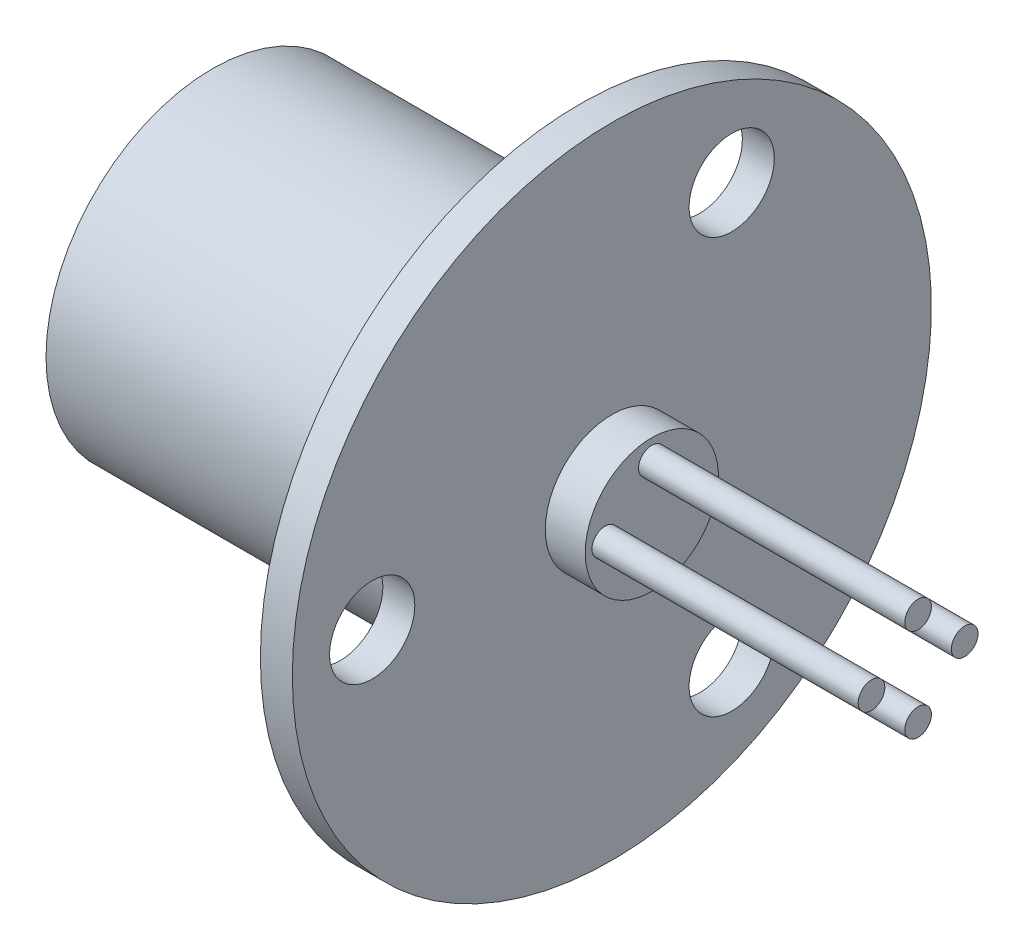
ISO-10303-21;
HEADER;
FILE_DESCRIPTION(('STEP AP214'),'2;1');
FILE_NAME('part.step','',(''),(''),'','','');
FILE_SCHEMA(('AUTOMOTIVE_DESIGN { 1 0 10303 214 1 1 1 1 }'));
ENDSEC;
DATA;
#1=APPLICATION_CONTEXT('core data for automotive mechanical design processes');
#2=APPLICATION_PROTOCOL_DEFINITION('international standard','automotive_design',2000,#1);
#3=PRODUCT_CONTEXT('',#1,'mechanical');
#4=PRODUCT('Part','Part','',(#3));
#5=PRODUCT_RELATED_PRODUCT_CATEGORY('part','',(#4));
#6=PRODUCT_DEFINITION_FORMATION('','',#4);
#7=PRODUCT_DEFINITION_CONTEXT('part definition',#1,'design');
#8=PRODUCT_DEFINITION('design','',#6,#7);
#9=PRODUCT_DEFINITION_SHAPE('','',#8);
#10=(LENGTH_UNIT() NAMED_UNIT(*) SI_UNIT(.MILLI.,.METRE.));
#11=(NAMED_UNIT(*) PLANE_ANGLE_UNIT() SI_UNIT($,.RADIAN.));
#12=(NAMED_UNIT(*) SI_UNIT($,.STERADIAN.) SOLID_ANGLE_UNIT());
#13=UNCERTAINTY_MEASURE_WITH_UNIT(LENGTH_MEASURE(1.E-05),#10,'distance_accuracy_value','');
#14=(GEOMETRIC_REPRESENTATION_CONTEXT(3) GLOBAL_UNCERTAINTY_ASSIGNED_CONTEXT((#13)) GLOBAL_UNIT_ASSIGNED_CONTEXT((#10,
#11,#12)) REPRESENTATION_CONTEXT('',''));
#15=CARTESIAN_POINT('',(0.,0.,0.));
#16=DIRECTION('',(0.,0.,1.));
#17=DIRECTION('',(1.,0.,0.));
#18=AXIS2_PLACEMENT_3D('',#15,#16,#17);
#19=CARTESIAN_POINT('',(0.,0.,0.));
#20=DIRECTION('',(-1.,0.,0.));
#21=DIRECTION('',(0.,0.,1.));
#22=AXIS2_PLACEMENT_3D('',#19,#20,#21);
#23=CYLINDRICAL_SURFACE('',#22,6.25);
#24=CARTESIAN_POINT('',(13.8,0.,0.));
#25=DIRECTION('',(-1.,0.,0.));
#26=DIRECTION('',(0.,0.,1.));
#27=AXIS2_PLACEMENT_3D('',#24,#25,#26);
#28=CIRCLE('',#27,6.25);
#29=CARTESIAN_POINT('',(13.8,0.,6.25));
#30=VERTEX_POINT('',#29);
#31=EDGE_CURVE('E72',#30,#30,#28,.T.);
#32=ORIENTED_EDGE('',*,*,#31,.T.);
#33=EDGE_LOOP('',(#32));
#34=FACE_BOUND('',#33,.T.);
#35=CARTESIAN_POINT('',(0.,0.,0.));
#36=DIRECTION('',(-1.,0.,0.));
#37=DIRECTION('',(0.,0.,1.));
#38=AXIS2_PLACEMENT_3D('',#35,#36,#37);
#39=CIRCLE('',#38,6.25);
#40=CARTESIAN_POINT('',(0.,0.,6.25));
#41=VERTEX_POINT('',#40);
#42=EDGE_CURVE('E93',#41,#41,#39,.T.);
#43=ORIENTED_EDGE('',*,*,#42,.F.);
#44=EDGE_LOOP('',(#43));
#45=FACE_BOUND('',#44,.T.);
#46=ADVANCED_FACE('F51',(#34,#45),#23,.T.);
#47=CARTESIAN_POINT('',(13.8,0.,0.));
#48=DIRECTION('',(-1.,0.,0.));
#49=DIRECTION('',(0.,0.,1.));
#50=AXIS2_PLACEMENT_3D('',#47,#48,#49);
#51=PLANE('',#50);
#52=CARTESIAN_POINT('',(13.8,7.79422863405993,-4.50000000000004));
#53=DIRECTION('',(-1.,0.,0.));
#54=DIRECTION('',(0.,0.,1.));
#55=AXIS2_PLACEMENT_3D('',#52,#53,#54);
#56=CIRCLE('',#55,1.6);
#57=CARTESIAN_POINT('',(13.8,7.79422863405993,-2.90000000000004));
#58=VERTEX_POINT('',#57);
#59=EDGE_CURVE('E103',#58,#58,#56,.T.);
#60=ORIENTED_EDGE('',*,*,#59,.F.);
#61=EDGE_LOOP('',(#60));
#62=FACE_BOUND('',#61,.T.);
#63=CARTESIAN_POINT('',(13.8,-7.79422863405999,-4.49999999999993));
#64=DIRECTION('',(-1.,0.,0.));
#65=DIRECTION('',(0.,0.,1.));
#66=AXIS2_PLACEMENT_3D('',#63,#64,#65);
#67=CIRCLE('',#66,1.6);
#68=CARTESIAN_POINT('',(13.8,-7.79422863405999,-2.89999999999993));
#69=VERTEX_POINT('',#68);
#70=EDGE_CURVE('E110',#69,#69,#67,.T.);
#71=ORIENTED_EDGE('',*,*,#70,.F.);
#72=EDGE_LOOP('',(#71));
#73=FACE_BOUND('',#72,.T.);
#74=CARTESIAN_POINT('',(13.8,0.,9.));
#75=DIRECTION('',(-1.,0.,0.));
#76=DIRECTION('',(0.,0.,1.));
#77=AXIS2_PLACEMENT_3D('',#74,#75,#76);
#78=CIRCLE('',#77,1.6);
#79=CARTESIAN_POINT('',(13.8,0.,10.6));
#80=VERTEX_POINT('',#79);
#81=EDGE_CURVE('E92',#80,#80,#78,.T.);
#82=ORIENTED_EDGE('',*,*,#81,.F.);
#83=EDGE_LOOP('',(#82));
#84=FACE_BOUND('',#83,.T.);
#85=CARTESIAN_POINT('',(13.8,0.,0.));
#86=DIRECTION('',(-1.,0.,0.));
#87=DIRECTION('',(0.,0.,1.));
#88=AXIS2_PLACEMENT_3D('',#85,#86,#87);
#89=CIRCLE('',#88,12.);
#90=CARTESIAN_POINT('',(13.8,0.,12.));
#91=VERTEX_POINT('',#90);
#92=EDGE_CURVE('E73',#91,#91,#89,.T.);
#93=ORIENTED_EDGE('',*,*,#92,.T.);
#94=EDGE_LOOP('',(#93));
#95=FACE_BOUND('',#94,.T.);
#96=ORIENTED_EDGE('',*,*,#31,.F.);
#97=EDGE_LOOP('',(#96));
#98=FACE_BOUND('',#97,.T.);
#99=ADVANCED_FACE('F154',(#62,#73,#84,#95,#98),#51,.T.);
#100=CARTESIAN_POINT('',(0.,0.,0.));
#101=DIRECTION('',(-1.,0.,0.));
#102=DIRECTION('',(0.,0.,1.));
#103=AXIS2_PLACEMENT_3D('',#100,#101,#102);
#104=CYLINDRICAL_SURFACE('',#103,12.);
#105=CARTESIAN_POINT('',(15.,0.,0.));
#106=DIRECTION('',(-1.,0.,0.));
#107=DIRECTION('',(0.,0.,1.));
#108=AXIS2_PLACEMENT_3D('',#105,#106,#107);
#109=CIRCLE('',#108,12.);
#110=CARTESIAN_POINT('',(15.,0.,12.));
#111=VERTEX_POINT('',#110);
#112=EDGE_CURVE('E76',#111,#111,#109,.T.);
#113=ORIENTED_EDGE('',*,*,#112,.T.);
#114=EDGE_LOOP('',(#113));
#115=FACE_BOUND('',#114,.T.);
#116=ORIENTED_EDGE('',*,*,#92,.F.);
#117=EDGE_LOOP('',(#116));
#118=FACE_BOUND('',#117,.T.);
#119=ADVANCED_FACE('F159',(#115,#118),#104,.T.);
#120=CARTESIAN_POINT('',(15.,0.,0.));
#121=DIRECTION('',(-1.,0.,0.));
#122=DIRECTION('',(0.,0.,1.));
#123=AXIS2_PLACEMENT_3D('',#120,#121,#122);
#124=PLANE('',#123);
#125=CARTESIAN_POINT('',(15.,7.79422863405993,-4.50000000000004));
#126=DIRECTION('',(1.,0.,0.));
#127=DIRECTION('',(0.,-0.866025403784436,0.500000000000004));
#128=AXIS2_PLACEMENT_3D('',#125,#126,#127);
#129=CIRCLE('',#128,1.6);
#130=CARTESIAN_POINT('',(15.,6.40858798800483,-3.70000000000003));
#131=VERTEX_POINT('',#130);
#132=EDGE_CURVE('E112',#131,#131,#129,.T.);
#133=ORIENTED_EDGE('',*,*,#132,.F.);
#134=EDGE_LOOP('',(#133));
#135=FACE_BOUND('',#134,.T.);
#136=CARTESIAN_POINT('',(15.,-7.79422863405999,-4.49999999999993));
#137=DIRECTION('',(1.,0.,0.));
#138=DIRECTION('',(0.,0.866025403784443,0.499999999999992));
#139=AXIS2_PLACEMENT_3D('',#136,#137,#138);
#140=CIRCLE('',#139,1.6);
#141=CARTESIAN_POINT('',(15.,-6.40858798800488,-3.69999999999994));
#142=VERTEX_POINT('',#141);
#143=EDGE_CURVE('E115',#142,#142,#140,.T.);
#144=ORIENTED_EDGE('',*,*,#143,.F.);
#145=EDGE_LOOP('',(#144));
#146=FACE_BOUND('',#145,.T.);
#147=CARTESIAN_POINT('',(15.,0.,9.));
#148=DIRECTION('',(1.,0.,0.));
#149=DIRECTION('',(0.,0.,-1.));
#150=AXIS2_PLACEMENT_3D('',#147,#148,#149);
#151=CIRCLE('',#150,1.6);
#152=CARTESIAN_POINT('',(15.,0.,7.4));
#153=VERTEX_POINT('',#152);
#154=EDGE_CURVE('E97',#153,#153,#151,.T.);
#155=ORIENTED_EDGE('',*,*,#154,.F.);
#156=EDGE_LOOP('',(#155));
#157=FACE_BOUND('',#156,.T.);
#158=ORIENTED_EDGE('',*,*,#112,.F.);
#159=EDGE_LOOP('',(#158));
#160=FACE_BOUND('',#159,.T.);
#161=CARTESIAN_POINT('',(15.,0.,0.));
#162=DIRECTION('',(-1.,0.,0.));
#163=DIRECTION('',(0.,0.,1.));
#164=AXIS2_PLACEMENT_3D('',#161,#162,#163);
#165=CIRCLE('',#164,2.5);
#166=CARTESIAN_POINT('',(15.,0.,2.5));
#167=VERTEX_POINT('',#166);
#168=EDGE_CURVE('E84',#167,#167,#165,.T.);
#169=ORIENTED_EDGE('',*,*,#168,.T.);
#170=EDGE_LOOP('',(#169));
#171=FACE_BOUND('',#170,.T.);
#172=ADVANCED_FACE('F183',(#135,#146,#157,#160,#171),#124,.F.);
#173=CARTESIAN_POINT('',(0.,0.,0.));
#174=DIRECTION('',(-1.,0.,0.));
#175=DIRECTION('',(0.,0.,1.));
#176=AXIS2_PLACEMENT_3D('',#173,#174,#175);
#177=CYLINDRICAL_SURFACE('',#176,2.5);
#178=CARTESIAN_POINT('',(16.5,0.,0.));
#179=DIRECTION('',(-1.,0.,0.));
#180=DIRECTION('',(0.,0.,1.));
#181=AXIS2_PLACEMENT_3D('',#178,#179,#180);
#182=CIRCLE('',#181,2.5);
#183=CARTESIAN_POINT('',(16.5,0.,2.5));
#184=VERTEX_POINT('',#183);
#185=EDGE_CURVE('E87',#184,#184,#182,.T.);
#186=ORIENTED_EDGE('',*,*,#185,.T.);
#187=EDGE_LOOP('',(#186));
#188=FACE_BOUND('',#187,.T.);
#189=ORIENTED_EDGE('',*,*,#168,.F.);
#190=EDGE_LOOP('',(#189));
#191=FACE_BOUND('',#190,.T.);
#192=ADVANCED_FACE('F179',(#188,#191),#177,.T.);
#193=CARTESIAN_POINT('',(16.5,0.,0.));
#194=DIRECTION('',(-1.,0.,0.));
#195=DIRECTION('',(0.,0.,1.));
#196=AXIS2_PLACEMENT_3D('',#193,#194,#195);
#197=PLANE('',#196);
#198=CARTESIAN_POINT('',(16.5,1.75,0.));
#199=DIRECTION('',(-1.,0.,0.));
#200=DIRECTION('',(0.,0.,1.));
#201=AXIS2_PLACEMENT_3D('',#198,#199,#200);
#202=CIRCLE('',#201,0.5);
#203=CARTESIAN_POINT('',(16.5,1.75,0.499999999999994));
#204=VERTEX_POINT('',#203);
#205=EDGE_CURVE('E10',#204,#204,#202,.F.);
#206=ORIENTED_EDGE('',*,*,#205,.F.);
#207=EDGE_LOOP('',(#206));
#208=FACE_BOUND('',#207,.T.);
#209=CARTESIAN_POINT('',(16.5,0.,-1.75));
#210=DIRECTION('',(-1.,0.,0.));
#211=DIRECTION('',(0.,0.,1.));
#212=AXIS2_PLACEMENT_3D('',#209,#210,#211);
#213=CIRCLE('',#212,0.5);
#214=CARTESIAN_POINT('',(16.5,0.,-1.25));
#215=VERTEX_POINT('',#214);
#216=EDGE_CURVE('E59',#215,#215,#213,.F.);
#217=ORIENTED_EDGE('',*,*,#216,.F.);
#218=EDGE_LOOP('',(#217));
#219=FACE_BOUND('',#218,.T.);
#220=CARTESIAN_POINT('',(16.5,-1.75,0.));
#221=DIRECTION('',(-1.,0.,0.));
#222=DIRECTION('',(0.,0.,1.));
#223=AXIS2_PLACEMENT_3D('',#220,#221,#222);
#224=CIRCLE('',#223,0.5);
#225=CARTESIAN_POINT('',(16.5,-1.75,0.500000000000018));
#226=VERTEX_POINT('',#225);
#227=EDGE_CURVE('E64',#226,#226,#224,.F.);
#228=ORIENTED_EDGE('',*,*,#227,.F.);
#229=EDGE_LOOP('',(#228));
#230=FACE_BOUND('',#229,.T.);
#231=CARTESIAN_POINT('',(16.5,0.,1.75));
#232=DIRECTION('',(1.,0.,0.));
#233=DIRECTION('',(0.,0.,-1.));
#234=AXIS2_PLACEMENT_3D('',#231,#232,#233);
#235=CIRCLE('',#234,0.5);
#236=CARTESIAN_POINT('',(16.5,0.,1.25));
#237=VERTEX_POINT('',#236);
#238=EDGE_CURVE('E69',#237,#237,#235,.T.);
#239=ORIENTED_EDGE('',*,*,#238,.F.);
#240=EDGE_LOOP('',(#239));
#241=FACE_BOUND('',#240,.T.);
#242=ORIENTED_EDGE('',*,*,#185,.F.);
#243=EDGE_LOOP('',(#242));
#244=FACE_BOUND('',#243,.T.);
#245=ADVANCED_FACE('F166',(#208,#219,#230,#241,#244),#197,.F.);
#246=CARTESIAN_POINT('',(0.,0.,0.));
#247=DIRECTION('',(-1.,0.,0.));
#248=DIRECTION('',(0.,0.,1.));
#249=AXIS2_PLACEMENT_3D('',#246,#247,#248);
#250=PLANE('',#249);
#251=ORIENTED_EDGE('',*,*,#42,.T.);
#252=EDGE_LOOP('',(#251));
#253=FACE_BOUND('',#252,.T.);
#254=ADVANCED_FACE('F167',(#253),#250,.T.);
#255=CARTESIAN_POINT('',(11.8,0.,9.));
#256=DIRECTION('',(1.,0.,0.));
#257=DIRECTION('',(0.,0.,-1.));
#258=AXIS2_PLACEMENT_3D('',#255,#256,#257);
#259=CYLINDRICAL_SURFACE('',#258,1.6);
#260=ORIENTED_EDGE('',*,*,#81,.T.);
#261=EDGE_LOOP('',(#260));
#262=FACE_BOUND('',#261,.T.);
#263=ORIENTED_EDGE('',*,*,#154,.T.);
#264=EDGE_LOOP('',(#263));
#265=FACE_BOUND('',#264,.T.);
#266=ADVANCED_FACE('F169',(#262,#265),#259,.F.);
#267=CARTESIAN_POINT('',(11.8,-7.79422863405999,-4.49999999999993));
#268=DIRECTION('',(1.,0.,0.));
#269=DIRECTION('',(0.,0.,-1.));
#270=AXIS2_PLACEMENT_3D('',#267,#268,#269);
#271=CYLINDRICAL_SURFACE('',#270,1.6);
#272=ORIENTED_EDGE('',*,*,#70,.T.);
#273=EDGE_LOOP('',(#272));
#274=FACE_BOUND('',#273,.T.);
#275=ORIENTED_EDGE('',*,*,#143,.T.);
#276=EDGE_LOOP('',(#275));
#277=FACE_BOUND('',#276,.T.);
#278=ADVANCED_FACE('F173',(#274,#277),#271,.F.);
#279=CARTESIAN_POINT('',(11.8,7.79422863405993,-4.50000000000004));
#280=DIRECTION('',(1.,0.,0.));
#281=DIRECTION('',(0.,0.,-1.));
#282=AXIS2_PLACEMENT_3D('',#279,#280,#281);
#283=CYLINDRICAL_SURFACE('',#282,1.6);
#284=ORIENTED_EDGE('',*,*,#59,.T.);
#285=EDGE_LOOP('',(#284));
#286=FACE_BOUND('',#285,.T.);
#287=ORIENTED_EDGE('',*,*,#132,.T.);
#288=EDGE_LOOP('',(#287));
#289=FACE_BOUND('',#288,.T.);
#290=ADVANCED_FACE('F239',(#286,#289),#283,.F.);
#291=CARTESIAN_POINT('',(26.5,0.,1.75));
#292=DIRECTION('',(-1.,0.,0.));
#293=DIRECTION('',(0.,0.,1.));
#294=AXIS2_PLACEMENT_3D('',#291,#292,#293);
#295=CYLINDRICAL_SURFACE('',#294,0.5);
#296=CARTESIAN_POINT('',(26.5,0.,1.75));
#297=DIRECTION('',(1.,0.,0.));
#298=DIRECTION('',(0.,0.,-1.));
#299=AXIS2_PLACEMENT_3D('',#296,#297,#298);
#300=CIRCLE('',#299,0.5);
#301=CARTESIAN_POINT('',(26.5,0.,1.25));
#302=VERTEX_POINT('',#301);
#303=EDGE_CURVE('E117',#302,#302,#300,.T.);
#304=ORIENTED_EDGE('',*,*,#303,.F.);
#305=EDGE_LOOP('',(#304));
#306=FACE_BOUND('',#305,.T.);
#307=ORIENTED_EDGE('',*,*,#238,.T.);
#308=EDGE_LOOP('',(#307));
#309=FACE_BOUND('',#308,.T.);
#310=ADVANCED_FACE('F249',(#306,#309),#295,.T.);
#311=CARTESIAN_POINT('',(26.5,0.,1.75));
#312=DIRECTION('',(1.,0.,0.));
#313=DIRECTION('',(0.,0.,-1.));
#314=AXIS2_PLACEMENT_3D('',#311,#312,#313);
#315=PLANE('',#314);
#316=ORIENTED_EDGE('',*,*,#303,.T.);
#317=EDGE_LOOP('',(#316));
#318=FACE_BOUND('',#317,.T.);
#319=ADVANCED_FACE('F259',(#318),#315,.T.);
#320=CARTESIAN_POINT('',(26.5,-1.75,0.));
#321=DIRECTION('',(-1.,0.,0.));
#322=DIRECTION('',(0.,0.,1.));
#323=AXIS2_PLACEMENT_3D('',#320,#321,#322);
#324=CYLINDRICAL_SURFACE('',#323,0.5);
#325=CARTESIAN_POINT('',(26.5,-1.75,0.));
#326=DIRECTION('',(1.,0.,0.));
#327=DIRECTION('',(0.,1.,0.));
#328=AXIS2_PLACEMENT_3D('',#325,#326,#327);
#329=CIRCLE('',#328,0.5);
#330=CARTESIAN_POINT('',(26.5,-1.25,0.));
#331=VERTEX_POINT('',#330);
#332=EDGE_CURVE('E130',#331,#331,#329,.T.);
#333=ORIENTED_EDGE('',*,*,#332,.F.);
#334=EDGE_LOOP('',(#333));
#335=FACE_BOUND('',#334,.T.);
#336=ORIENTED_EDGE('',*,*,#227,.T.);
#337=EDGE_LOOP('',(#336));
#338=FACE_BOUND('',#337,.T.);
#339=ADVANCED_FACE('F270',(#335,#338),#324,.T.);
#340=CARTESIAN_POINT('',(26.5,-1.75,0.));
#341=DIRECTION('',(1.,0.,0.));
#342=DIRECTION('',(0.,1.,0.));
#343=AXIS2_PLACEMENT_3D('',#340,#341,#342);
#344=PLANE('',#343);
#345=ORIENTED_EDGE('',*,*,#332,.T.);
#346=EDGE_LOOP('',(#345));
#347=FACE_BOUND('',#346,.T.);
#348=ADVANCED_FACE('F269',(#347),#344,.T.);
#349=CARTESIAN_POINT('',(26.5,0.,-1.75));
#350=DIRECTION('',(-1.,0.,0.));
#351=DIRECTION('',(0.,0.,1.));
#352=AXIS2_PLACEMENT_3D('',#349,#350,#351);
#353=CYLINDRICAL_SURFACE('',#352,0.5);
#354=CARTESIAN_POINT('',(26.5,0.,-1.75));
#355=DIRECTION('',(1.,0.,0.));
#356=DIRECTION('',(0.,0.,1.));
#357=AXIS2_PLACEMENT_3D('',#354,#355,#356);
#358=CIRCLE('',#357,0.5);
#359=CARTESIAN_POINT('',(26.5,0.,-1.25));
#360=VERTEX_POINT('',#359);
#361=EDGE_CURVE('E132',#360,#360,#358,.T.);
#362=ORIENTED_EDGE('',*,*,#361,.F.);
#363=EDGE_LOOP('',(#362));
#364=FACE_BOUND('',#363,.T.);
#365=ORIENTED_EDGE('',*,*,#216,.T.);
#366=EDGE_LOOP('',(#365));
#367=FACE_BOUND('',#366,.T.);
#368=ADVANCED_FACE('F151',(#364,#367),#353,.T.);
#369=CARTESIAN_POINT('',(26.5,0.,-1.75));
#370=DIRECTION('',(1.,0.,0.));
#371=DIRECTION('',(0.,0.,1.));
#372=AXIS2_PLACEMENT_3D('',#369,#370,#371);
#373=PLANE('',#372);
#374=ORIENTED_EDGE('',*,*,#361,.T.);
#375=EDGE_LOOP('',(#374));
#376=FACE_BOUND('',#375,.T.);
#377=ADVANCED_FACE('F141',(#376),#373,.T.);
#378=CARTESIAN_POINT('',(26.5,1.75,0.));
#379=DIRECTION('',(-1.,0.,0.));
#380=DIRECTION('',(0.,0.,1.));
#381=AXIS2_PLACEMENT_3D('',#378,#379,#380);
#382=CYLINDRICAL_SURFACE('',#381,0.5);
#383=CARTESIAN_POINT('',(26.5,1.75,0.));
#384=DIRECTION('',(1.,0.,0.));
#385=DIRECTION('',(0.,-1.,0.));
#386=AXIS2_PLACEMENT_3D('',#383,#384,#385);
#387=CIRCLE('',#386,0.5);
#388=CARTESIAN_POINT('',(26.5,1.25,0.));
#389=VERTEX_POINT('',#388);
#390=EDGE_CURVE('E127',#389,#389,#387,.T.);
#391=ORIENTED_EDGE('',*,*,#390,.F.);
#392=EDGE_LOOP('',(#391));
#393=FACE_BOUND('',#392,.T.);
#394=ORIENTED_EDGE('',*,*,#205,.T.);
#395=EDGE_LOOP('',(#394));
#396=FACE_BOUND('',#395,.T.);
#397=ADVANCED_FACE('F143',(#393,#396),#382,.T.);
#398=CARTESIAN_POINT('',(26.5,1.75,0.));
#399=DIRECTION('',(1.,0.,0.));
#400=DIRECTION('',(0.,-1.,0.));
#401=AXIS2_PLACEMENT_3D('',#398,#399,#400);
#402=PLANE('',#401);
#403=ORIENTED_EDGE('',*,*,#390,.T.);
#404=EDGE_LOOP('',(#403));
#405=FACE_BOUND('',#404,.T.);
#406=ADVANCED_FACE('F138',(#405),#402,.T.);
#407=CLOSED_SHELL('',(#46,#99,#119,#172,#192,#245,#254,#266,#278,#290,#310,#319,#339,#348,#368,
#377,#397,#406));
#408=MANIFOLD_SOLID_BREP('B2',#407);
#409=ADVANCED_BREP_SHAPE_REPRESENTATION('',(#18,#408),#14);
#410=SHAPE_DEFINITION_REPRESENTATION(#9,#409);
ENDSEC;
END-ISO-10303-21;
